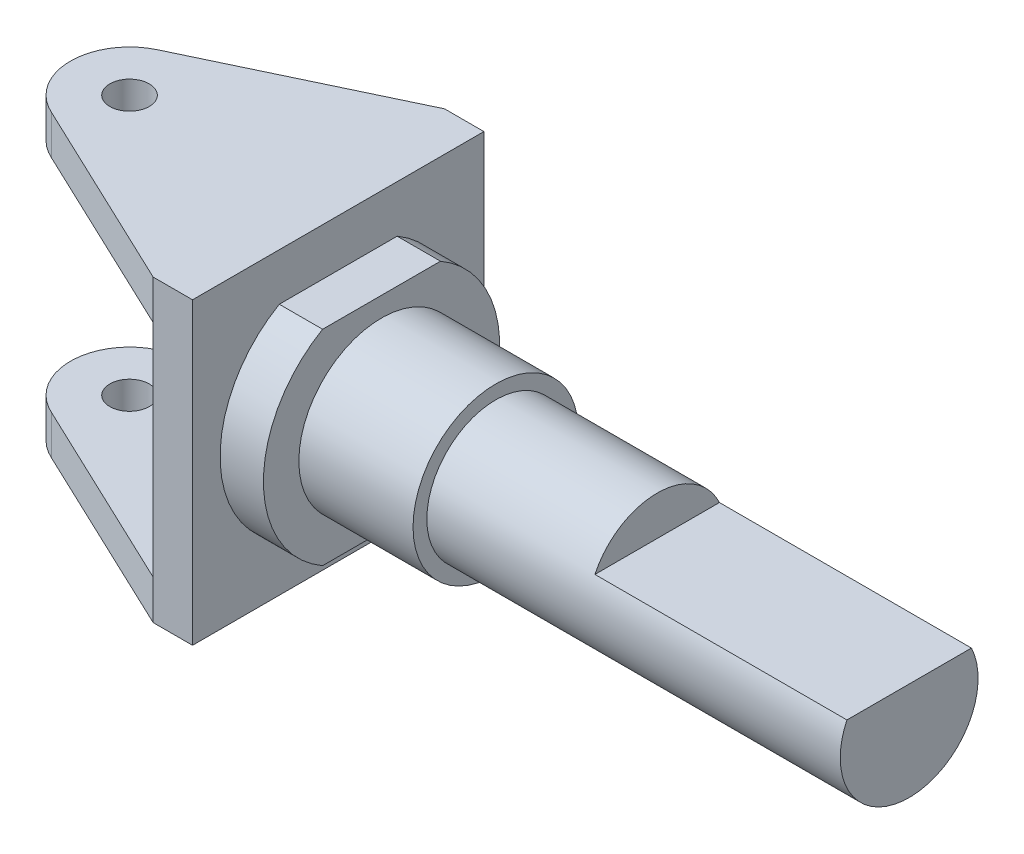
ISO-10303-21;
HEADER;
FILE_DESCRIPTION(('STEP AP214'),'2;1');
FILE_NAME('part.step','',(''),(''),'','','');
FILE_SCHEMA(('AUTOMOTIVE_DESIGN { 1 0 10303 214 1 1 1 1 }'));
ENDSEC;
DATA;
#1=APPLICATION_CONTEXT('core data for automotive mechanical design processes');
#2=APPLICATION_PROTOCOL_DEFINITION('international standard','automotive_design',2000,#1);
#3=PRODUCT_CONTEXT('',#1,'mechanical');
#4=PRODUCT('Part','Part','',(#3));
#5=PRODUCT_RELATED_PRODUCT_CATEGORY('part','',(#4));
#6=PRODUCT_DEFINITION_FORMATION('','',#4);
#7=PRODUCT_DEFINITION_CONTEXT('part definition',#1,'design');
#8=PRODUCT_DEFINITION('design','',#6,#7);
#9=PRODUCT_DEFINITION_SHAPE('','',#8);
#10=(LENGTH_UNIT() NAMED_UNIT(*) SI_UNIT(.MILLI.,.METRE.));
#11=(NAMED_UNIT(*) PLANE_ANGLE_UNIT() SI_UNIT($,.RADIAN.));
#12=(NAMED_UNIT(*) SI_UNIT($,.STERADIAN.) SOLID_ANGLE_UNIT());
#13=UNCERTAINTY_MEASURE_WITH_UNIT(LENGTH_MEASURE(1.E-05),#10,'distance_accuracy_value','');
#14=(GEOMETRIC_REPRESENTATION_CONTEXT(3) GLOBAL_UNCERTAINTY_ASSIGNED_CONTEXT((#13)) GLOBAL_UNIT_ASSIGNED_CONTEXT((#10,
#11,#12)) REPRESENTATION_CONTEXT('',''));
#15=CARTESIAN_POINT('',(0.,0.,0.));
#16=DIRECTION('',(0.,0.,1.));
#17=DIRECTION('',(1.,0.,0.));
#18=AXIS2_PLACEMENT_3D('',#15,#16,#17);
#19=CARTESIAN_POINT('',(-80.12141562294,0.,0.));
#20=DIRECTION('',(-1.,0.,0.));
#21=DIRECTION('',(0.,0.,1.));
#22=AXIS2_PLACEMENT_3D('',#19,#20,#21);
#23=PLANE('',#22);
#24=DIRECTION('',(0.,1.,0.));
#25=VECTOR('',#24,1.);
#26=CARTESIAN_POINT('',(-80.12141562294,0.,37.));
#27=LINE('',#26,#25);
#28=CARTESIAN_POINT('',(-80.12141562294,-28.,37.));
#29=VERTEX_POINT('',#28);
#30=CARTESIAN_POINT('',(-80.12141562294,28.,37.));
#31=VERTEX_POINT('',#30);
#32=EDGE_CURVE('E223',#29,#31,#27,.T.);
#33=ORIENTED_EDGE('',*,*,#32,.T.);
#34=DIRECTION('',(0.,0.,1.));
#35=VECTOR('',#34,1.);
#36=CARTESIAN_POINT('',(-80.12141562294,28.,0.));
#37=LINE('',#36,#35);
#38=CARTESIAN_POINT('',(-80.12141562294,28.,-37.));
#39=VERTEX_POINT('',#38);
#40=EDGE_CURVE('E156',#39,#31,#37,.T.);
#41=ORIENTED_EDGE('',*,*,#40,.F.);
#42=DIRECTION('',(0.,1.,0.));
#43=VECTOR('',#42,1.);
#44=CARTESIAN_POINT('',(-80.12141562294,0.,-37.));
#45=LINE('',#44,#43);
#46=CARTESIAN_POINT('',(-80.12141562294,-28.,-37.));
#47=VERTEX_POINT('',#46);
#48=EDGE_CURVE('E222',#47,#39,#45,.T.);
#49=ORIENTED_EDGE('',*,*,#48,.F.);
#50=DIRECTION('',(0.,0.,1.));
#51=VECTOR('',#50,1.);
#52=CARTESIAN_POINT('',(-80.12141562294,-28.,0.));
#53=LINE('',#52,#51);
#54=EDGE_CURVE('E196',#47,#29,#53,.T.);
#55=ORIENTED_EDGE('',*,*,#54,.T.);
#56=EDGE_LOOP('',(#33,#41,#49,#55));
#57=FACE_BOUND('',#56,.T.);
#58=ADVANCED_FACE('F32',(#57),#23,.T.);
#59=CARTESIAN_POINT('',(-70.12141562294,0.,0.));
#60=DIRECTION('',(-1.,0.,0.));
#61=DIRECTION('',(0.,0.,1.));
#62=AXIS2_PLACEMENT_3D('',#59,#60,#61);
#63=CYLINDRICAL_SURFACE('',#62,30.);
#64=CARTESIAN_POINT('',(-70.12141562294,0.,0.));
#65=DIRECTION('',(-1.,0.,0.));
#66=DIRECTION('',(0.,0.,1.));
#67=AXIS2_PLACEMENT_3D('',#64,#65,#66);
#68=CIRCLE('',#67,30.);
#69=CARTESIAN_POINT('',(-70.12141562294,-26.,14.9666295470958));
#70=VERTEX_POINT('',#69);
#71=CARTESIAN_POINT('',(-70.12141562294,26.,14.9666295470958));
#72=VERTEX_POINT('',#71);
#73=EDGE_CURVE('E290',#70,#72,#68,.T.);
#74=ORIENTED_EDGE('',*,*,#73,.F.);
#75=DIRECTION('',(-1.,0.,0.));
#76=VECTOR('',#75,1.);
#77=CARTESIAN_POINT('',(-6.12141562294002,-26.,14.9666295470958));
#78=LINE('',#77,#76);
#79=CARTESIAN_POINT('',(-59.12141562294,-26.,14.9666295470958));
#80=VERTEX_POINT('',#79);
#81=EDGE_CURVE('E251',#80,#70,#78,.T.);
#82=ORIENTED_EDGE('',*,*,#81,.F.);
#83=CARTESIAN_POINT('',(-59.12141562294,0.,0.));
#84=DIRECTION('',(-1.,0.,0.));
#85=DIRECTION('',(0.,0.,1.));
#86=AXIS2_PLACEMENT_3D('',#83,#84,#85);
#87=CIRCLE('',#86,30.);
#88=CARTESIAN_POINT('',(-59.12141562294,26.,14.9666295470958));
#89=VERTEX_POINT('',#88);
#90=EDGE_CURVE('E286',#80,#89,#87,.T.);
#91=ORIENTED_EDGE('',*,*,#90,.T.);
#92=DIRECTION('',(-1.,0.,0.));
#93=VECTOR('',#92,1.);
#94=CARTESIAN_POINT('',(-6.12141562294002,26.,14.9666295470958));
#95=LINE('',#94,#93);
#96=EDGE_CURVE('E250',#89,#72,#95,.T.);
#97=ORIENTED_EDGE('',*,*,#96,.T.);
#98=EDGE_LOOP('',(#74,#82,#91,#97));
#99=FACE_BOUND('',#98,.T.);
#100=ADVANCED_FACE('F34',(#99),#63,.T.);
#101=CARTESIAN_POINT('',(-59.12141562294,26.,-14.9666295470958));
#102=VERTEX_POINT('',#101);
#103=CARTESIAN_POINT('',(-59.12141562294,-26.,-14.9666295470958));
#104=VERTEX_POINT('',#103);
#105=EDGE_CURVE('E289',#102,#104,#87,.T.);
#106=ORIENTED_EDGE('',*,*,#105,.T.);
#107=DIRECTION('',(-1.,0.,0.));
#108=VECTOR('',#107,1.);
#109=CARTESIAN_POINT('',(-6.12141562294002,-26.,-14.9666295470958));
#110=LINE('',#109,#108);
#111=CARTESIAN_POINT('',(-70.12141562294,-26.,-14.9666295470958));
#112=VERTEX_POINT('',#111);
#113=EDGE_CURVE('E55',#104,#112,#110,.T.);
#114=ORIENTED_EDGE('',*,*,#113,.T.);
#115=CARTESIAN_POINT('',(-70.12141562294,26.,-14.9666295470958));
#116=VERTEX_POINT('',#115);
#117=EDGE_CURVE('E291',#116,#112,#68,.T.);
#118=ORIENTED_EDGE('',*,*,#117,.F.);
#119=DIRECTION('',(-1.,0.,0.));
#120=VECTOR('',#119,1.);
#121=CARTESIAN_POINT('',(-6.12141562294002,26.,-14.9666295470958));
#122=LINE('',#121,#120);
#123=EDGE_CURVE('E258',#102,#116,#122,.T.);
#124=ORIENTED_EDGE('',*,*,#123,.F.);
#125=EDGE_LOOP('',(#106,#114,#118,#124));
#126=FACE_BOUND('',#125,.T.);
#127=ADVANCED_FACE('F303',(#126),#63,.T.);
#128=CARTESIAN_POINT('',(-59.12141562294,0.,0.));
#129=DIRECTION('',(1.,0.,0.));
#130=DIRECTION('',(0.,0.,-1.));
#131=AXIS2_PLACEMENT_3D('',#128,#129,#130);
#132=PLANE('',#131);
#133=CARTESIAN_POINT('',(-59.12141562294,0.,0.));
#134=DIRECTION('',(-1.,0.,0.));
#135=DIRECTION('',(0.,0.,1.));
#136=AXIS2_PLACEMENT_3D('',#133,#134,#135);
#137=CIRCLE('',#136,21.);
#138=CARTESIAN_POINT('',(-59.12141562294,0.,21.));
#139=VERTEX_POINT('',#138);
#140=EDGE_CURVE('E283',#139,#139,#137,.T.);
#141=ORIENTED_EDGE('',*,*,#140,.T.);
#142=EDGE_LOOP('',(#141));
#143=FACE_BOUND('',#142,.T.);
#144=ORIENTED_EDGE('',*,*,#90,.F.);
#145=DIRECTION('',(0.,0.,-1.));
#146=VECTOR('',#145,1.);
#147=CARTESIAN_POINT('',(-59.12141562294,-26.,0.));
#148=LINE('',#147,#146);
#149=EDGE_CURVE('E11',#80,#104,#148,.T.);
#150=ORIENTED_EDGE('',*,*,#149,.T.);
#151=ORIENTED_EDGE('',*,*,#105,.F.);
#152=DIRECTION('',(0.,0.,-1.));
#153=VECTOR('',#152,1.);
#154=CARTESIAN_POINT('',(-59.12141562294,26.,0.));
#155=LINE('',#154,#153);
#156=EDGE_CURVE('E40',#89,#102,#155,.T.);
#157=ORIENTED_EDGE('',*,*,#156,.F.);
#158=EDGE_LOOP('',(#144,#150,#151,#157));
#159=FACE_BOUND('',#158,.T.);
#160=ADVANCED_FACE('F307',(#143,#159),#132,.T.);
#161=CARTESIAN_POINT('',(-70.12141562294,0.,0.));
#162=DIRECTION('',(-1.,0.,0.));
#163=DIRECTION('',(0.,0.,1.));
#164=AXIS2_PLACEMENT_3D('',#161,#162,#163);
#165=CYLINDRICAL_SURFACE('',#164,21.);
#166=CARTESIAN_POINT('',(-30.12141562294,0.,0.));
#167=DIRECTION('',(-1.,0.,0.));
#168=DIRECTION('',(0.,0.,1.));
#169=AXIS2_PLACEMENT_3D('',#166,#167,#168);
#170=CIRCLE('',#169,21.);
#171=CARTESIAN_POINT('',(-30.12141562294,0.,21.));
#172=VERTEX_POINT('',#171);
#173=EDGE_CURVE('E280',#172,#172,#170,.T.);
#174=ORIENTED_EDGE('',*,*,#173,.T.);
#175=EDGE_LOOP('',(#174));
#176=FACE_BOUND('',#175,.T.);
#177=ORIENTED_EDGE('',*,*,#140,.F.);
#178=EDGE_LOOP('',(#177));
#179=FACE_BOUND('',#178,.T.);
#180=ADVANCED_FACE('F534',(#176,#179),#165,.T.);
#181=CARTESIAN_POINT('',(-30.12141562294,0.,0.));
#182=DIRECTION('',(1.,0.,0.));
#183=DIRECTION('',(0.,0.,-1.));
#184=AXIS2_PLACEMENT_3D('',#181,#182,#183);
#185=PLANE('',#184);
#186=CARTESIAN_POINT('',(-30.12141562294,0.,0.));
#187=DIRECTION('',(-1.,0.,0.));
#188=DIRECTION('',(0.,0.,1.));
#189=AXIS2_PLACEMENT_3D('',#186,#187,#188);
#190=CIRCLE('',#189,17.5);
#191=CARTESIAN_POINT('',(-30.12141562294,0.,17.5));
#192=VERTEX_POINT('',#191);
#193=EDGE_CURVE('E277',#192,#192,#190,.T.);
#194=ORIENTED_EDGE('',*,*,#193,.T.);
#195=EDGE_LOOP('',(#194));
#196=FACE_BOUND('',#195,.T.);
#197=ORIENTED_EDGE('',*,*,#173,.F.);
#198=EDGE_LOOP('',(#197));
#199=FACE_BOUND('',#198,.T.);
#200=ADVANCED_FACE('F570',(#196,#199),#185,.T.);
#201=CARTESIAN_POINT('',(-70.12141562294,0.,0.));
#202=DIRECTION('',(-1.,0.,0.));
#203=DIRECTION('',(0.,0.,1.));
#204=AXIS2_PLACEMENT_3D('',#201,#202,#203);
#205=CYLINDRICAL_SURFACE('',#204,17.5);
#206=DIRECTION('',(1.,0.,0.));
#207=VECTOR('',#206,1.);
#208=CARTESIAN_POINT('',(10.87858437706,7.5,15.8113883008419));
#209=LINE('',#208,#207);
#210=CARTESIAN_POINT('',(10.87858437706,7.5,15.8113883008419));
#211=VERTEX_POINT('',#210);
#212=CARTESIAN_POINT('',(74.87858437706,7.5,15.8113883008419));
#213=VERTEX_POINT('',#212);
#214=EDGE_CURVE('E268',#211,#213,#209,.T.);
#215=ORIENTED_EDGE('',*,*,#214,.F.);
#216=CARTESIAN_POINT('',(10.87858437706,0.,0.));
#217=DIRECTION('',(1.,0.,0.));
#218=DIRECTION('',(0.,0.,-1.));
#219=AXIS2_PLACEMENT_3D('',#216,#217,#218);
#220=CIRCLE('',#219,17.5);
#221=CARTESIAN_POINT('',(10.87858437706,7.5,-15.8113883008419));
#222=VERTEX_POINT('',#221);
#223=EDGE_CURVE('E263',#222,#211,#220,.T.);
#224=ORIENTED_EDGE('',*,*,#223,.F.);
#225=DIRECTION('',(1.,0.,0.));
#226=VECTOR('',#225,1.);
#227=CARTESIAN_POINT('',(10.87858437706,7.5,-15.8113883008419));
#228=LINE('',#227,#226);
#229=CARTESIAN_POINT('',(74.87858437706,7.5,-15.8113883008419));
#230=VERTEX_POINT('',#229);
#231=EDGE_CURVE('E270',#222,#230,#228,.T.);
#232=ORIENTED_EDGE('',*,*,#231,.T.);
#233=CARTESIAN_POINT('',(74.87858437706,0.,0.));
#234=DIRECTION('',(-1.,0.,0.));
#235=DIRECTION('',(0.,0.,1.));
#236=AXIS2_PLACEMENT_3D('',#233,#234,#235);
#237=CIRCLE('',#236,17.5);
#238=EDGE_CURVE('E273',#230,#213,#237,.T.);
#239=ORIENTED_EDGE('',*,*,#238,.T.);
#240=EDGE_LOOP('',(#215,#224,#232,#239));
#241=FACE_BOUND('',#240,.T.);
#242=ORIENTED_EDGE('',*,*,#193,.F.);
#243=EDGE_LOOP('',(#242));
#244=FACE_BOUND('',#243,.T.);
#245=ADVANCED_FACE('F560',(#241,#244),#205,.T.);
#246=CARTESIAN_POINT('',(74.87858437706,0.,0.));
#247=DIRECTION('',(1.,0.,0.));
#248=DIRECTION('',(0.,0.,-1.));
#249=AXIS2_PLACEMENT_3D('',#246,#247,#248);
#250=PLANE('',#249);
#251=DIRECTION('',(0.,0.,-1.));
#252=VECTOR('',#251,1.);
#253=CARTESIAN_POINT('',(74.87858437706,7.5,0.));
#254=LINE('',#253,#252);
#255=EDGE_CURVE('E254',#213,#230,#254,.T.);
#256=ORIENTED_EDGE('',*,*,#255,.F.);
#257=ORIENTED_EDGE('',*,*,#238,.F.);
#258=EDGE_LOOP('',(#256,#257));
#259=FACE_BOUND('',#258,.T.);
#260=ADVANCED_FACE('F550',(#259),#250,.T.);
#261=CARTESIAN_POINT('',(10.87858437706,7.5,0.));
#262=DIRECTION('',(0.,-1.,0.));
#263=DIRECTION('',(0.,0.,-1.));
#264=AXIS2_PLACEMENT_3D('',#261,#262,#263);
#265=PLANE('',#264);
#266=ORIENTED_EDGE('',*,*,#255,.T.);
#267=ORIENTED_EDGE('',*,*,#231,.F.);
#268=DIRECTION('',(0.,0.,-1.));
#269=VECTOR('',#268,1.);
#270=CARTESIAN_POINT('',(10.87858437706,7.5,0.));
#271=LINE('',#270,#269);
#272=EDGE_CURVE('E265',#211,#222,#271,.T.);
#273=ORIENTED_EDGE('',*,*,#272,.F.);
#274=ORIENTED_EDGE('',*,*,#214,.T.);
#275=EDGE_LOOP('',(#266,#267,#273,#274));
#276=FACE_BOUND('',#275,.T.);
#277=ADVANCED_FACE('F318',(#276),#265,.F.);
#278=CARTESIAN_POINT('',(10.87858437706,0.,0.));
#279=DIRECTION('',(1.,0.,0.));
#280=DIRECTION('',(0.,0.,-1.));
#281=AXIS2_PLACEMENT_3D('',#278,#279,#280);
#282=PLANE('',#281);
#283=ORIENTED_EDGE('',*,*,#223,.T.);
#284=ORIENTED_EDGE('',*,*,#272,.T.);
#285=EDGE_LOOP('',(#283,#284));
#286=FACE_BOUND('',#285,.T.);
#287=ADVANCED_FACE('F311',(#286),#282,.T.);
#288=CARTESIAN_POINT('',(-6.12141562294002,26.,0.));
#289=DIRECTION('',(0.,-1.,0.));
#290=DIRECTION('',(0.,0.,-1.));
#291=AXIS2_PLACEMENT_3D('',#288,#289,#290);
#292=PLANE('',#291);
#293=ORIENTED_EDGE('',*,*,#156,.T.);
#294=ORIENTED_EDGE('',*,*,#123,.T.);
#295=DIRECTION('',(0.,0.,1.));
#296=VECTOR('',#295,1.);
#297=CARTESIAN_POINT('',(-70.12141562294,26.,0.));
#298=LINE('',#297,#296);
#299=EDGE_CURVE('E247',#116,#72,#298,.T.);
#300=ORIENTED_EDGE('',*,*,#299,.T.);
#301=ORIENTED_EDGE('',*,*,#96,.F.);
#302=EDGE_LOOP('',(#293,#294,#300,#301));
#303=FACE_BOUND('',#302,.T.);
#304=ADVANCED_FACE('F309',(#303),#292,.F.);
#305=CARTESIAN_POINT('',(-6.12141562294002,-26.,0.));
#306=DIRECTION('',(0.,-1.,0.));
#307=DIRECTION('',(0.,0.,-1.));
#308=AXIS2_PLACEMENT_3D('',#305,#306,#307);
#309=PLANE('',#308);
#310=ORIENTED_EDGE('',*,*,#81,.T.);
#311=DIRECTION('',(0.,0.,1.));
#312=VECTOR('',#311,1.);
#313=CARTESIAN_POINT('',(-70.12141562294,-26.,0.));
#314=LINE('',#313,#312);
#315=EDGE_CURVE('E248',#112,#70,#314,.T.);
#316=ORIENTED_EDGE('',*,*,#315,.F.);
#317=ORIENTED_EDGE('',*,*,#113,.F.);
#318=ORIENTED_EDGE('',*,*,#149,.F.);
#319=EDGE_LOOP('',(#310,#316,#317,#318));
#320=FACE_BOUND('',#319,.T.);
#321=ADVANCED_FACE('F299',(#320),#309,.T.);
#322=CARTESIAN_POINT('',(-70.12141562294,0.,0.));
#323=DIRECTION('',(-1.,0.,0.));
#324=DIRECTION('',(0.,0.,1.));
#325=AXIS2_PLACEMENT_3D('',#322,#323,#324);
#326=PLANE('',#325);
#327=DIRECTION('',(0.,0.,1.));
#328=VECTOR('',#327,1.);
#329=CARTESIAN_POINT('',(-70.12141562294,-38.,0.));
#330=LINE('',#329,#328);
#331=CARTESIAN_POINT('',(-70.12141562294,-38.,-37.));
#332=VERTEX_POINT('',#331);
#333=CARTESIAN_POINT('',(-70.12141562294,-38.,37.));
#334=VERTEX_POINT('',#333);
#335=EDGE_CURVE('E219',#332,#334,#330,.T.);
#336=ORIENTED_EDGE('',*,*,#335,.F.);
#337=DIRECTION('',(0.,1.,0.));
#338=VECTOR('',#337,1.);
#339=CARTESIAN_POINT('',(-70.12141562294,0.,-37.));
#340=LINE('',#339,#338);
#341=CARTESIAN_POINT('',(-70.12141562294,38.,-37.));
#342=VERTEX_POINT('',#341);
#343=EDGE_CURVE('E236',#332,#342,#340,.T.);
#344=ORIENTED_EDGE('',*,*,#343,.T.);
#345=DIRECTION('',(0.,0.,1.));
#346=VECTOR('',#345,1.);
#347=CARTESIAN_POINT('',(-70.12141562294,38.,0.));
#348=LINE('',#347,#346);
#349=CARTESIAN_POINT('',(-70.12141562294,38.,37.));
#350=VERTEX_POINT('',#349);
#351=EDGE_CURVE('E233',#342,#350,#348,.T.);
#352=ORIENTED_EDGE('',*,*,#351,.T.);
#353=DIRECTION('',(0.,1.,0.));
#354=VECTOR('',#353,1.);
#355=CARTESIAN_POINT('',(-70.12141562294,0.,37.));
#356=LINE('',#355,#354);
#357=EDGE_CURVE('E230',#334,#350,#356,.T.);
#358=ORIENTED_EDGE('',*,*,#357,.F.);
#359=EDGE_LOOP('',(#336,#344,#352,#358));
#360=FACE_BOUND('',#359,.T.);
#361=ORIENTED_EDGE('',*,*,#299,.F.);
#362=ORIENTED_EDGE('',*,*,#117,.T.);
#363=ORIENTED_EDGE('',*,*,#315,.T.);
#364=ORIENTED_EDGE('',*,*,#73,.T.);
#365=EDGE_LOOP('',(#361,#362,#363,#364));
#366=FACE_BOUND('',#365,.T.);
#367=ADVANCED_FACE('F297',(#360,#366),#326,.F.);
#368=CARTESIAN_POINT('',(-80.12141562294,-38.,0.));
#369=DIRECTION('',(0.,1.,0.));
#370=DIRECTION('',(0.,0.,1.));
#371=AXIS2_PLACEMENT_3D('',#368,#369,#370);
#372=PLANE('',#371);
#373=ORIENTED_EDGE('',*,*,#335,.T.);
#374=DIRECTION('',(1.,0.,0.));
#375=VECTOR('',#374,1.);
#376=CARTESIAN_POINT('',(-80.12141562294,-38.,37.));
#377=LINE('',#376,#375);
#378=CARTESIAN_POINT('',(-80.12141562294,-38.,37.));
#379=VERTEX_POINT('',#378);
#380=EDGE_CURVE('E244',#379,#334,#377,.T.);
#381=ORIENTED_EDGE('',*,*,#380,.F.);
#382=DIRECTION('',(-0.903469516729655,0.,-0.42865234437745));
#383=VECTOR('',#382,1.);
#384=CARTESIAN_POINT('',(-29.050885915202,-38.,61.2304824705787));
#385=LINE('',#384,#383);
#386=CARTESIAN_POINT('',(-129.249504521234,-38.,13.6911112205916));
#387=VERTEX_POINT('',#386);
#388=EDGE_CURVE('E202',#379,#387,#385,.T.);
#389=ORIENTED_EDGE('',*,*,#388,.T.);
#390=CARTESIAN_POINT('',(-123.12141562294,-38.,0.));
#391=DIRECTION('',(0.,1.,0.));
#392=DIRECTION('',(0.,0.,1.));
#393=AXIS2_PLACEMENT_3D('',#390,#391,#392);
#394=CIRCLE('',#393,15.);
#395=CARTESIAN_POINT('',(-129.550289517853,-38.,-13.5524750670609));
#396=VERTEX_POINT('',#395);
#397=EDGE_CURVE('E199',#396,#387,#394,.T.);
#398=ORIENTED_EDGE('',*,*,#397,.F.);
#399=DIRECTION('',(-0.903498337804061,0.,0.428591592994192));
#400=VECTOR('',#399,1.);
#401=CARTESIAN_POINT('',(-29.0451395131796,-38.,-61.2290014559394));
#402=LINE('',#401,#400);
#403=CARTESIAN_POINT('',(-80.12141562294,-38.,-37.));
#404=VERTEX_POINT('',#403);
#405=EDGE_CURVE('E195',#404,#396,#402,.T.);
#406=ORIENTED_EDGE('',*,*,#405,.F.);
#407=DIRECTION('',(1.,0.,0.));
#408=VECTOR('',#407,1.);
#409=CARTESIAN_POINT('',(-80.12141562294,-38.,-37.));
#410=LINE('',#409,#408);
#411=EDGE_CURVE('E227',#404,#332,#410,.T.);
#412=ORIENTED_EDGE('',*,*,#411,.T.);
#413=EDGE_LOOP('',(#373,#381,#389,#398,#406,#412));
#414=FACE_BOUND('',#413,.T.);
#415=CARTESIAN_POINT('',(-123.12141562294,-38.,0.));
#416=DIRECTION('',(0.,1.,0.));
#417=DIRECTION('',(0.,0.,1.));
#418=AXIS2_PLACEMENT_3D('',#415,#416,#417);
#419=CIRCLE('',#418,5.);
#420=CARTESIAN_POINT('',(-123.12141562294,-38.,5.));
#421=VERTEX_POINT('',#420);
#422=EDGE_CURVE('E192',#421,#421,#419,.T.);
#423=ORIENTED_EDGE('',*,*,#422,.T.);
#424=EDGE_LOOP('',(#423));
#425=FACE_BOUND('',#424,.T.);
#426=ADVANCED_FACE('F334',(#414,#425),#372,.F.);
#427=CARTESIAN_POINT('',(-80.12141562294,0.,37.));
#428=DIRECTION('',(0.,0.,-1.));
#429=DIRECTION('',(-1.,0.,0.));
#430=AXIS2_PLACEMENT_3D('',#427,#428,#429);
#431=PLANE('',#430);
#432=ORIENTED_EDGE('',*,*,#357,.T.);
#433=DIRECTION('',(1.,0.,0.));
#434=VECTOR('',#433,1.);
#435=CARTESIAN_POINT('',(-80.12141562294,38.,37.));
#436=LINE('',#435,#434);
#437=CARTESIAN_POINT('',(-80.12141562294,38.,37.));
#438=VERTEX_POINT('',#437);
#439=EDGE_CURVE('E242',#438,#350,#436,.T.);
#440=ORIENTED_EDGE('',*,*,#439,.F.);
#441=DIRECTION('',(0.,1.,0.));
#442=VECTOR('',#441,1.);
#443=CARTESIAN_POINT('',(-80.12141562294,28.,37.));
#444=LINE('',#443,#442);
#445=EDGE_CURVE('E188',#31,#438,#444,.T.);
#446=ORIENTED_EDGE('',*,*,#445,.F.);
#447=ORIENTED_EDGE('',*,*,#32,.F.);
#448=EDGE_CURVE('E47',#379,#29,#27,.T.);
#449=ORIENTED_EDGE('',*,*,#448,.F.);
#450=ORIENTED_EDGE('',*,*,#380,.T.);
#451=EDGE_LOOP('',(#432,#440,#446,#447,#449,#450));
#452=FACE_BOUND('',#451,.T.);
#453=ADVANCED_FACE('F344',(#452),#431,.F.);
#454=CARTESIAN_POINT('',(-80.12141562294,38.,0.));
#455=DIRECTION('',(0.,1.,0.));
#456=DIRECTION('',(0.,0.,1.));
#457=AXIS2_PLACEMENT_3D('',#454,#455,#456);
#458=PLANE('',#457);
#459=ORIENTED_EDGE('',*,*,#351,.F.);
#460=DIRECTION('',(1.,0.,0.));
#461=VECTOR('',#460,1.);
#462=CARTESIAN_POINT('',(-80.12141562294,38.,-37.));
#463=LINE('',#462,#461);
#464=CARTESIAN_POINT('',(-80.12141562294,38.,-37.));
#465=VERTEX_POINT('',#464);
#466=EDGE_CURVE('E240',#465,#342,#463,.T.);
#467=ORIENTED_EDGE('',*,*,#466,.F.);
#468=DIRECTION('',(-0.903498337804061,0.,0.428591592994192));
#469=VECTOR('',#468,1.);
#470=CARTESIAN_POINT('',(-29.0451395131796,38.,-61.2290014559394));
#471=LINE('',#470,#469);
#472=CARTESIAN_POINT('',(-129.550289517853,38.,-13.5524750670609));
#473=VERTEX_POINT('',#472);
#474=EDGE_CURVE('E181',#465,#473,#471,.T.);
#475=ORIENTED_EDGE('',*,*,#474,.T.);
#476=CARTESIAN_POINT('',(-123.12141562294,38.,0.));
#477=DIRECTION('',(0.,1.,0.));
#478=DIRECTION('',(0.,0.,1.));
#479=AXIS2_PLACEMENT_3D('',#476,#477,#478);
#480=CIRCLE('',#479,15.);
#481=CARTESIAN_POINT('',(-129.249504521234,38.,13.6911112205916));
#482=VERTEX_POINT('',#481);
#483=EDGE_CURVE('E151',#473,#482,#480,.T.);
#484=ORIENTED_EDGE('',*,*,#483,.T.);
#485=DIRECTION('',(-0.903469516729655,0.,-0.42865234437745));
#486=VECTOR('',#485,1.);
#487=CARTESIAN_POINT('',(-29.050885915202,38.,61.2304824705787));
#488=LINE('',#487,#486);
#489=EDGE_CURVE('E173',#438,#482,#488,.T.);
#490=ORIENTED_EDGE('',*,*,#489,.F.);
#491=ORIENTED_EDGE('',*,*,#439,.T.);
#492=EDGE_LOOP('',(#459,#467,#475,#484,#490,#491));
#493=FACE_BOUND('',#492,.T.);
#494=CARTESIAN_POINT('',(-123.12141562294,38.,0.));
#495=DIRECTION('',(0.,1.,0.));
#496=DIRECTION('',(0.,0.,1.));
#497=AXIS2_PLACEMENT_3D('',#494,#495,#496);
#498=CIRCLE('',#497,5.);
#499=CARTESIAN_POINT('',(-123.12141562294,38.,5.));
#500=VERTEX_POINT('',#499);
#501=EDGE_CURVE('E178',#500,#500,#498,.T.);
#502=ORIENTED_EDGE('',*,*,#501,.F.);
#503=EDGE_LOOP('',(#502));
#504=FACE_BOUND('',#503,.T.);
#505=ADVANCED_FACE('F340',(#493,#504),#458,.T.);
#506=CARTESIAN_POINT('',(-80.12141562294,0.,-37.));
#507=DIRECTION('',(0.,0.,-1.));
#508=DIRECTION('',(-1.,0.,0.));
#509=AXIS2_PLACEMENT_3D('',#506,#507,#508);
#510=PLANE('',#509);
#511=ORIENTED_EDGE('',*,*,#343,.F.);
#512=ORIENTED_EDGE('',*,*,#411,.F.);
#513=EDGE_CURVE('E224',#404,#47,#45,.T.);
#514=ORIENTED_EDGE('',*,*,#513,.T.);
#515=ORIENTED_EDGE('',*,*,#48,.T.);
#516=DIRECTION('',(0.,1.,0.));
#517=VECTOR('',#516,1.);
#518=CARTESIAN_POINT('',(-80.12141562294,28.,-37.));
#519=LINE('',#518,#517);
#520=EDGE_CURVE('E169',#39,#465,#519,.T.);
#521=ORIENTED_EDGE('',*,*,#520,.T.);
#522=ORIENTED_EDGE('',*,*,#466,.T.);
#523=EDGE_LOOP('',(#511,#512,#514,#515,#521,#522));
#524=FACE_BOUND('',#523,.T.);
#525=ADVANCED_FACE('F336',(#524),#510,.T.);
#526=CARTESIAN_POINT('',(-29.0451395131796,-38.,-61.2290014559394));
#527=DIRECTION('',(-0.428591592994192,0.,-0.903498337804061));
#528=DIRECTION('',(-0.903498337804061,0.,0.428591592994192));
#529=AXIS2_PLACEMENT_3D('',#526,#527,#528);
#530=PLANE('',#529);
#531=DIRECTION('',(-0.903498337804061,0.,0.428591592994192));
#532=VECTOR('',#531,1.);
#533=CARTESIAN_POINT('',(-29.0451395131796,-28.,-61.2290014559394));
#534=LINE('',#533,#532);
#535=CARTESIAN_POINT('',(-129.550289517853,-28.,-13.5524750670609));
#536=VERTEX_POINT('',#535);
#537=EDGE_CURVE('E207',#47,#536,#534,.T.);
#538=ORIENTED_EDGE('',*,*,#537,.F.);
#539=ORIENTED_EDGE('',*,*,#513,.F.);
#540=ORIENTED_EDGE('',*,*,#405,.T.);
#541=DIRECTION('',(0.,1.,0.));
#542=VECTOR('',#541,1.);
#543=CARTESIAN_POINT('',(-129.550289517853,-38.,-13.5524750670609));
#544=LINE('',#543,#542);
#545=EDGE_CURVE('E204',#396,#536,#544,.T.);
#546=ORIENTED_EDGE('',*,*,#545,.T.);
#547=EDGE_LOOP('',(#538,#539,#540,#546));
#548=FACE_BOUND('',#547,.T.);
#549=ADVANCED_FACE('F339',(#548),#530,.T.);
#550=CARTESIAN_POINT('',(-29.050885915202,-38.,61.2304824705787));
#551=DIRECTION('',(0.42865234437745,0.,-0.903469516729655));
#552=DIRECTION('',(-0.903469516729655,0.,-0.42865234437745));
#553=AXIS2_PLACEMENT_3D('',#550,#551,#552);
#554=PLANE('',#553);
#555=DIRECTION('',(-0.903469516729655,0.,-0.42865234437745));
#556=VECTOR('',#555,1.);
#557=CARTESIAN_POINT('',(-29.050885915202,-28.,61.2304824705787));
#558=LINE('',#557,#556);
#559=CARTESIAN_POINT('',(-129.249504521234,-28.,13.6911112205916));
#560=VERTEX_POINT('',#559);
#561=EDGE_CURVE('E213',#29,#560,#558,.T.);
#562=ORIENTED_EDGE('',*,*,#561,.T.);
#563=DIRECTION('',(0.,1.,0.));
#564=VECTOR('',#563,1.);
#565=CARTESIAN_POINT('',(-129.249504521234,-38.,13.6911112205916));
#566=LINE('',#565,#564);
#567=EDGE_CURVE('E217',#387,#560,#566,.T.);
#568=ORIENTED_EDGE('',*,*,#567,.F.);
#569=ORIENTED_EDGE('',*,*,#388,.F.);
#570=ORIENTED_EDGE('',*,*,#448,.T.);
#571=EDGE_LOOP('',(#562,#568,#569,#570));
#572=FACE_BOUND('',#571,.T.);
#573=ADVANCED_FACE('F361',(#572),#554,.F.);
#574=CARTESIAN_POINT('',(-123.12141562294,-38.,0.));
#575=DIRECTION('',(0.,1.,0.));
#576=DIRECTION('',(0.,0.,1.));
#577=AXIS2_PLACEMENT_3D('',#574,#575,#576);
#578=CYLINDRICAL_SURFACE('',#577,5.);
#579=ORIENTED_EDGE('',*,*,#422,.F.);
#580=EDGE_LOOP('',(#579));
#581=FACE_BOUND('',#580,.T.);
#582=CARTESIAN_POINT('',(-123.12141562294,-28.,0.));
#583=DIRECTION('',(0.,1.,0.));
#584=DIRECTION('',(0.,0.,1.));
#585=AXIS2_PLACEMENT_3D('',#582,#583,#584);
#586=CIRCLE('',#585,5.);
#587=CARTESIAN_POINT('',(-123.12141562294,-28.,5.));
#588=VERTEX_POINT('',#587);
#589=EDGE_CURVE('E187',#588,#588,#586,.T.);
#590=ORIENTED_EDGE('',*,*,#589,.T.);
#591=EDGE_LOOP('',(#590));
#592=FACE_BOUND('',#591,.T.);
#593=ADVANCED_FACE('F330',(#581,#592),#578,.F.);
#594=CARTESIAN_POINT('',(-123.12141562294,-38.,0.));
#595=DIRECTION('',(0.,1.,0.));
#596=DIRECTION('',(0.,0.,1.));
#597=AXIS2_PLACEMENT_3D('',#594,#595,#596);
#598=CYLINDRICAL_SURFACE('',#597,15.);
#599=CARTESIAN_POINT('',(-123.12141562294,-28.,0.));
#600=DIRECTION('',(0.,1.,0.));
#601=DIRECTION('',(0.,0.,1.));
#602=AXIS2_PLACEMENT_3D('',#599,#600,#601);
#603=CIRCLE('',#602,15.);
#604=EDGE_CURVE('E210',#536,#560,#603,.T.);
#605=ORIENTED_EDGE('',*,*,#604,.F.);
#606=ORIENTED_EDGE('',*,*,#545,.F.);
#607=ORIENTED_EDGE('',*,*,#397,.T.);
#608=ORIENTED_EDGE('',*,*,#567,.T.);
#609=EDGE_LOOP('',(#605,#606,#607,#608));
#610=FACE_BOUND('',#609,.T.);
#611=ADVANCED_FACE('F360',(#610),#598,.T.);
#612=CARTESIAN_POINT('',(0.,-28.,0.));
#613=DIRECTION('',(0.,1.,0.));
#614=DIRECTION('',(0.,0.,1.));
#615=AXIS2_PLACEMENT_3D('',#612,#613,#614);
#616=PLANE('',#615);
#617=ORIENTED_EDGE('',*,*,#589,.F.);
#618=EDGE_LOOP('',(#617));
#619=FACE_BOUND('',#618,.T.);
#620=ORIENTED_EDGE('',*,*,#537,.T.);
#621=ORIENTED_EDGE('',*,*,#604,.T.);
#622=ORIENTED_EDGE('',*,*,#561,.F.);
#623=ORIENTED_EDGE('',*,*,#54,.F.);
#624=EDGE_LOOP('',(#620,#621,#622,#623));
#625=FACE_BOUND('',#624,.T.);
#626=ADVANCED_FACE('F364',(#619,#625),#616,.T.);
#627=CARTESIAN_POINT('',(-29.0451395131796,28.,-61.2290014559394));
#628=DIRECTION('',(-0.428591592994192,0.,-0.903498337804061));
#629=DIRECTION('',(-0.903498337804061,0.,0.428591592994192));
#630=AXIS2_PLACEMENT_3D('',#627,#628,#629);
#631=PLANE('',#630);
#632=ORIENTED_EDGE('',*,*,#474,.F.);
#633=ORIENTED_EDGE('',*,*,#520,.F.);
#634=DIRECTION('',(-0.903498337804061,0.,0.428591592994192));
#635=VECTOR('',#634,1.);
#636=CARTESIAN_POINT('',(-29.0451395131796,28.,-61.2290014559394));
#637=LINE('',#636,#635);
#638=CARTESIAN_POINT('',(-129.550289517853,28.,-13.5524750670609));
#639=VERTEX_POINT('',#638);
#640=EDGE_CURVE('E162',#39,#639,#637,.T.);
#641=ORIENTED_EDGE('',*,*,#640,.T.);
#642=DIRECTION('',(0.,1.,0.));
#643=VECTOR('',#642,1.);
#644=CARTESIAN_POINT('',(-129.550289517853,28.,-13.5524750670609));
#645=LINE('',#644,#643);
#646=EDGE_CURVE('E146',#639,#473,#645,.T.);
#647=ORIENTED_EDGE('',*,*,#646,.T.);
#648=EDGE_LOOP('',(#632,#633,#641,#647));
#649=FACE_BOUND('',#648,.T.);
#650=ADVANCED_FACE('F167',(#649),#631,.T.);
#651=CARTESIAN_POINT('',(-29.050885915202,28.,61.2304824705787));
#652=DIRECTION('',(0.42865234437745,0.,-0.903469516729655));
#653=DIRECTION('',(-0.903469516729655,0.,-0.42865234437745));
#654=AXIS2_PLACEMENT_3D('',#651,#652,#653);
#655=PLANE('',#654);
#656=ORIENTED_EDGE('',*,*,#489,.T.);
#657=DIRECTION('',(0.,1.,0.));
#658=VECTOR('',#657,1.);
#659=CARTESIAN_POINT('',(-129.249504521234,28.,13.6911112205916));
#660=LINE('',#659,#658);
#661=CARTESIAN_POINT('',(-129.249504521234,28.,13.6911112205916));
#662=VERTEX_POINT('',#661);
#663=EDGE_CURVE('E155',#662,#482,#660,.T.);
#664=ORIENTED_EDGE('',*,*,#663,.F.);
#665=DIRECTION('',(-0.903469516729655,0.,-0.42865234437745));
#666=VECTOR('',#665,1.);
#667=CARTESIAN_POINT('',(-29.050885915202,28.,61.2304824705787));
#668=LINE('',#667,#666);
#669=EDGE_CURVE('E164',#31,#662,#668,.T.);
#670=ORIENTED_EDGE('',*,*,#669,.F.);
#671=ORIENTED_EDGE('',*,*,#445,.T.);
#672=EDGE_LOOP('',(#656,#664,#670,#671));
#673=FACE_BOUND('',#672,.T.);
#674=ADVANCED_FACE('F441',(#673),#655,.F.);
#675=CARTESIAN_POINT('',(-123.12141562294,28.,0.));
#676=DIRECTION('',(0.,1.,0.));
#677=DIRECTION('',(0.,0.,1.));
#678=AXIS2_PLACEMENT_3D('',#675,#676,#677);
#679=CYLINDRICAL_SURFACE('',#678,5.);
#680=CARTESIAN_POINT('',(-123.12141562294,28.,0.));
#681=DIRECTION('',(0.,1.,0.));
#682=DIRECTION('',(0.,0.,1.));
#683=AXIS2_PLACEMENT_3D('',#680,#681,#682);
#684=CIRCLE('',#683,5.);
#685=CARTESIAN_POINT('',(-123.12141562294,28.,5.));
#686=VERTEX_POINT('',#685);
#687=EDGE_CURVE('E170',#686,#686,#684,.T.);
#688=ORIENTED_EDGE('',*,*,#687,.F.);
#689=EDGE_LOOP('',(#688));
#690=FACE_BOUND('',#689,.T.);
#691=ORIENTED_EDGE('',*,*,#501,.T.);
#692=EDGE_LOOP('',(#691));
#693=FACE_BOUND('',#692,.T.);
#694=ADVANCED_FACE('F450',(#690,#693),#679,.F.);
#695=CARTESIAN_POINT('',(-123.12141562294,28.,0.));
#696=DIRECTION('',(0.,1.,0.));
#697=DIRECTION('',(0.,0.,1.));
#698=AXIS2_PLACEMENT_3D('',#695,#696,#697);
#699=CYLINDRICAL_SURFACE('',#698,15.);
#700=ORIENTED_EDGE('',*,*,#483,.F.);
#701=ORIENTED_EDGE('',*,*,#646,.F.);
#702=CARTESIAN_POINT('',(-123.12141562294,28.,0.));
#703=DIRECTION('',(0.,1.,0.));
#704=DIRECTION('',(0.,0.,1.));
#705=AXIS2_PLACEMENT_3D('',#702,#703,#704);
#706=CIRCLE('',#705,15.);
#707=EDGE_CURVE('E149',#639,#662,#706,.T.);
#708=ORIENTED_EDGE('',*,*,#707,.T.);
#709=ORIENTED_EDGE('',*,*,#663,.T.);
#710=EDGE_LOOP('',(#700,#701,#708,#709));
#711=FACE_BOUND('',#710,.T.);
#712=ADVANCED_FACE('F148',(#711),#699,.T.);
#713=CARTESIAN_POINT('',(0.,28.,0.));
#714=DIRECTION('',(0.,1.,0.));
#715=DIRECTION('',(0.,0.,1.));
#716=AXIS2_PLACEMENT_3D('',#713,#714,#715);
#717=PLANE('',#716);
#718=ORIENTED_EDGE('',*,*,#687,.T.);
#719=EDGE_LOOP('',(#718));
#720=FACE_BOUND('',#719,.T.);
#721=ORIENTED_EDGE('',*,*,#640,.F.);
#722=ORIENTED_EDGE('',*,*,#40,.T.);
#723=ORIENTED_EDGE('',*,*,#669,.T.);
#724=ORIENTED_EDGE('',*,*,#707,.F.);
#725=EDGE_LOOP('',(#721,#722,#723,#724));
#726=FACE_BOUND('',#725,.T.);
#727=ADVANCED_FACE('F160',(#720,#726),#717,.F.);
#728=CLOSED_SHELL('',(#58,#100,#127,#160,#180,#200,#245,#260,#277,#287,#304,#321,#367,#426,#453,
#505,#525,#549,#573,#593,#611,#626,#650,#674,#694,#712,#727));
#729=MANIFOLD_SOLID_BREP('B2',#728);
#730=ADVANCED_BREP_SHAPE_REPRESENTATION('',(#18,#729),#14);
#731=SHAPE_DEFINITION_REPRESENTATION(#9,#730);
ENDSEC;
END-ISO-10303-21;
